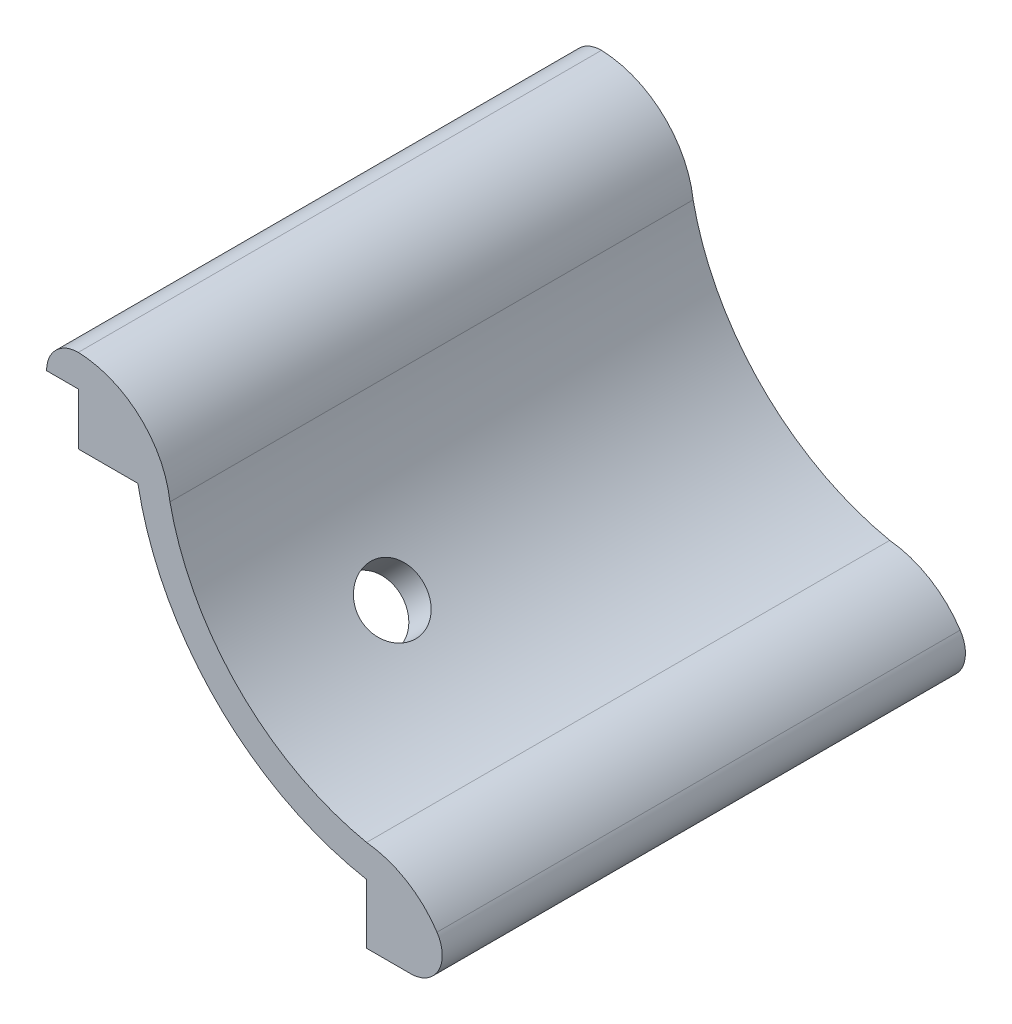
ISO-10303-21;
HEADER;
FILE_DESCRIPTION(('STEP AP214'),'2;1');
FILE_NAME('part.step','',(''),(''),'','','');
FILE_SCHEMA(('AUTOMOTIVE_DESIGN { 1 0 10303 214 1 1 1 1 }'));
ENDSEC;
DATA;
#1=APPLICATION_CONTEXT('core data for automotive mechanical design processes');
#2=APPLICATION_PROTOCOL_DEFINITION('international standard','automotive_design',2000,#1);
#3=PRODUCT_CONTEXT('',#1,'mechanical');
#4=PRODUCT('Part','Part','',(#3));
#5=PRODUCT_RELATED_PRODUCT_CATEGORY('part','',(#4));
#6=PRODUCT_DEFINITION_FORMATION('','',#4);
#7=PRODUCT_DEFINITION_CONTEXT('part definition',#1,'design');
#8=PRODUCT_DEFINITION('design','',#6,#7);
#9=PRODUCT_DEFINITION_SHAPE('','',#8);
#10=(LENGTH_UNIT() NAMED_UNIT(*) SI_UNIT(.MILLI.,.METRE.));
#11=(NAMED_UNIT(*) PLANE_ANGLE_UNIT() SI_UNIT($,.RADIAN.));
#12=(NAMED_UNIT(*) SI_UNIT($,.STERADIAN.) SOLID_ANGLE_UNIT());
#13=UNCERTAINTY_MEASURE_WITH_UNIT(LENGTH_MEASURE(1.E-05),#10,'distance_accuracy_value','');
#14=(GEOMETRIC_REPRESENTATION_CONTEXT(3) GLOBAL_UNCERTAINTY_ASSIGNED_CONTEXT((#13)) GLOBAL_UNIT_ASSIGNED_CONTEXT((#10,
#11,#12)) REPRESENTATION_CONTEXT('',''));
#15=CARTESIAN_POINT('',(0.,0.,0.));
#16=DIRECTION('',(0.,0.,1.));
#17=DIRECTION('',(1.,0.,0.));
#18=AXIS2_PLACEMENT_3D('',#15,#16,#17);
#19=CARTESIAN_POINT('',(-3.15197105507584,-11.938,-104.775));
#20=DIRECTION('',(0.,1.,0.));
#21=DIRECTION('',(0.,0.,1.));
#22=AXIS2_PLACEMENT_3D('',#19,#20,#21);
#23=PLANE('',#22);
#24=DIRECTION('',(-1.,0.,0.));
#25=VECTOR('',#24,1.);
#26=CARTESIAN_POINT('',(-3.15197105507584,-11.938,0.));
#27=LINE('',#26,#25);
#28=CARTESIAN_POINT('',(8.80657813501905,-11.938,0.));
#29=VERTEX_POINT('',#28);
#30=CARTESIAN_POINT('',(0.,-11.938,0.));
#31=VERTEX_POINT('',#30);
#32=EDGE_CURVE('E234',#29,#31,#27,.T.);
#33=ORIENTED_EDGE('',*,*,#32,.F.);
#34=DIRECTION('',(0.,0.,1.));
#35=VECTOR('',#34,1.);
#36=CARTESIAN_POINT('',(8.80657813501905,-11.938,104.775));
#37=LINE('',#36,#35);
#38=CARTESIAN_POINT('',(8.80657813501905,-11.938,92.5957));
#39=VERTEX_POINT('',#38);
#40=EDGE_CURVE('E339',#29,#39,#37,.T.);
#41=ORIENTED_EDGE('',*,*,#40,.T.);
#42=DIRECTION('',(1.,0.,0.));
#43=VECTOR('',#42,1.);
#44=CARTESIAN_POINT('',(-1.80789407603243,-11.938,92.5957));
#45=LINE('',#44,#43);
#46=CARTESIAN_POINT('',(0.,-11.938,92.5957));
#47=VERTEX_POINT('',#46);
#48=EDGE_CURVE('E376',#47,#39,#45,.T.);
#49=ORIENTED_EDGE('',*,*,#48,.F.);
#50=DIRECTION('',(0.,0.,1.));
#51=VECTOR('',#50,1.);
#52=CARTESIAN_POINT('',(0.,-11.938,92.5957));
#53=LINE('',#52,#51);
#54=EDGE_CURVE('E369',#31,#47,#53,.T.);
#55=ORIENTED_EDGE('',*,*,#54,.F.);
#56=EDGE_LOOP('',(#33,#41,#49,#55));
#57=FACE_BOUND('',#56,.T.);
#58=ADVANCED_FACE('F48',(#57),#23,.F.);
#59=CARTESIAN_POINT('',(-57.7342,44.7636331488296,-104.775));
#60=DIRECTION('',(1.,0.,0.));
#61=DIRECTION('',(0.,0.,-1.));
#62=AXIS2_PLACEMENT_3D('',#59,#60,#61);
#63=PLANE('',#62);
#64=DIRECTION('',(0.,0.,1.));
#65=VECTOR('',#64,1.);
#66=CARTESIAN_POINT('',(-57.7342,56.197173041991,0.));
#67=LINE('',#66,#65);
#68=CARTESIAN_POINT('',(-57.7342,56.197173041991,0.));
#69=VERTEX_POINT('',#68);
#70=CARTESIAN_POINT('',(-57.7342,56.197173041991,92.5957));
#71=VERTEX_POINT('',#70);
#72=EDGE_CURVE('E189',#69,#71,#67,.T.);
#73=ORIENTED_EDGE('',*,*,#72,.F.);
#74=DIRECTION('',(0.,1.,0.));
#75=VECTOR('',#74,1.);
#76=CARTESIAN_POINT('',(-57.7342,44.7636331488296,0.));
#77=LINE('',#76,#75);
#78=CARTESIAN_POINT('',(-57.7342,45.796198295609,0.));
#79=VERTEX_POINT('',#78);
#80=EDGE_CURVE('E206',#79,#69,#77,.T.);
#81=ORIENTED_EDGE('',*,*,#80,.F.);
#82=DIRECTION('',(0.,0.,-1.));
#83=VECTOR('',#82,1.);
#84=CARTESIAN_POINT('',(-57.7342,45.796198295609,92.5957));
#85=LINE('',#84,#83);
#86=CARTESIAN_POINT('',(-57.7342,45.796198295609,92.5957));
#87=VERTEX_POINT('',#86);
#88=EDGE_CURVE('E481',#87,#79,#85,.T.);
#89=ORIENTED_EDGE('',*,*,#88,.F.);
#90=DIRECTION('',(0.,-1.,0.));
#91=VECTOR('',#90,1.);
#92=CARTESIAN_POINT('',(-57.7342,43.4795574980974,92.5957));
#93=LINE('',#92,#91);
#94=EDGE_CURVE('E485',#71,#87,#93,.T.);
#95=ORIENTED_EDGE('',*,*,#94,.F.);
#96=EDGE_LOOP('',(#73,#81,#89,#95));
#97=FACE_BOUND('',#96,.T.);
#98=ADVANCED_FACE('F261',(#97),#63,.F.);
#99=CARTESIAN_POINT('',(-57.7342,56.197173041991,98.425));
#100=VERTEX_POINT('',#99);
#101=CARTESIAN_POINT('',(-57.7342,56.197173041991,104.775));
#102=VERTEX_POINT('',#101);
#103=EDGE_CURVE('E340',#100,#102,#67,.T.);
#104=ORIENTED_EDGE('',*,*,#103,.F.);
#105=DIRECTION('',(0.,-1.,0.));
#106=VECTOR('',#105,1.);
#107=CARTESIAN_POINT('',(-57.7342,43.479557498097,98.425));
#108=LINE('',#107,#106);
#109=CARTESIAN_POINT('',(-57.7342,45.796198295609,98.425));
#110=VERTEX_POINT('',#109);
#111=EDGE_CURVE('E273',#100,#110,#108,.T.);
#112=ORIENTED_EDGE('',*,*,#111,.T.);
#113=DIRECTION('',(0.,0.,1.));
#114=VECTOR('',#113,1.);
#115=CARTESIAN_POINT('',(-57.7342,45.796198365176,98.425));
#116=LINE('',#115,#114);
#117=CARTESIAN_POINT('',(-57.7342,45.7961983303925,104.775));
#118=VERTEX_POINT('',#117);
#119=EDGE_CURVE('E446',#110,#118,#116,.T.);
#120=ORIENTED_EDGE('',*,*,#119,.T.);
#121=DIRECTION('',(0.,1.,0.));
#122=VECTOR('',#121,1.);
#123=CARTESIAN_POINT('',(-57.7342,44.7636331488296,104.775));
#124=LINE('',#123,#122);
#125=EDGE_CURVE('E248',#118,#102,#124,.T.);
#126=ORIENTED_EDGE('',*,*,#125,.T.);
#127=EDGE_LOOP('',(#104,#112,#120,#126));
#128=FACE_BOUND('',#127,.T.);
#129=ADVANCED_FACE('F304',(#128),#63,.F.);
#130=CARTESIAN_POINT('',(10.3996216396257,56.1958216396257,104.775));
#131=DIRECTION('',(0.,0.,-1.));
#132=DIRECTION('',(-1.,0.,0.));
#133=AXIS2_PLACEMENT_3D('',#130,#131,#132);
#134=CYLINDRICAL_SURFACE('',#133,50.8493081391342);
#135=CARTESIAN_POINT('',(-20.784677775749,16.0312650231152,74.1653983481804));
#136=CARTESIAN_POINT('',(-20.7846758379988,16.0312640782977,73.9877425355122));
#137=CARTESIAN_POINT('',(-20.7906163656934,16.0358738632272,73.8101166359393));
#138=CARTESIAN_POINT('',(-20.8143178376221,16.0542925575826,73.456078640127));
#139=CARTESIAN_POINT('',(-20.8320814626029,16.0681035532744,73.2796668283348));
#140=CARTESIAN_POINT('',(-20.8792768997005,16.104880828446,72.9292457067245));
#141=CARTESIAN_POINT('',(-20.9087174107754,16.1278539335154,72.7552382883509));
#142=CARTESIAN_POINT('',(-20.9789911767397,16.1828639104535,72.4109289915647));
#143=CARTESIAN_POINT('',(-21.0198286055127,16.2149041030144,72.2406284954137));
#144=CARTESIAN_POINT('',(-21.1124489123162,16.2878648376146,71.90518108893));
#145=CARTESIAN_POINT('',(-21.1642202199296,16.3287759934616,71.7400289408855));
#146=CARTESIAN_POINT('',(-21.2782644666517,16.4193339838851,71.4157869498506));
#147=CARTESIAN_POINT('',(-21.3405412736183,16.4689840361942,71.2566993662228));
#148=CARTESIAN_POINT('',(-21.4749665766108,16.5767583301998,70.9458433130397));
#149=CARTESIAN_POINT('',(-21.5471096505836,16.6348779185654,70.7940708849377));
#150=CARTESIAN_POINT('',(-21.7006640586808,16.7593719366749,70.4987463716751));
#151=CARTESIAN_POINT('',(-21.7820788236987,16.8257494230139,70.3551973592307));
#152=CARTESIAN_POINT('',(-21.9538234493409,16.9667619165018,70.076727608308));
#153=CARTESIAN_POINT('',(-22.0441927786658,17.0414336741289,69.9418498192395));
#154=CARTESIAN_POINT('',(-22.2327644790782,17.1984554560064,69.6823414984428));
#155=CARTESIAN_POINT('',(-22.3309697347996,17.2808083097954,69.5577147750395));
#156=CARTESIAN_POINT('',(-22.5342991771346,17.4527356384182,69.319671966118));
#157=CARTESIAN_POINT('',(-22.6394211541478,17.5423078090223,69.2062523290974));
#158=CARTESIAN_POINT('',(-22.8557557722319,17.7282721832445,68.9913354332248));
#159=CARTESIAN_POINT('',(-22.966970645668,17.8246668903868,68.8898425876238));
#160=CARTESIAN_POINT('',(-23.1948591810651,18.0240260827484,68.6992672889067));
#161=CARTESIAN_POINT('',(-23.3115479330361,18.1270090530023,68.6102222062909));
#162=CARTESIAN_POINT('',(-23.5491526960708,18.3387457346387,68.4455091667207));
#163=CARTESIAN_POINT('',(-23.6700702597575,18.447501573302,68.3698461861408));
#164=CARTESIAN_POINT('',(-23.9150674434826,18.6700758491484,68.2325177007512));
#165=CARTESIAN_POINT('',(-24.0391457826943,18.7838922491736,68.1708466233539));
#166=CARTESIAN_POINT('',(-24.2895177842526,19.0159213967149,68.0619012297004));
#167=CARTESIAN_POINT('',(-24.4158122423365,19.1341357411945,68.0146322014569));
#168=CARTESIAN_POINT('',(-24.7951058861629,19.4929157175488,67.8954892598048));
#169=CARTESIAN_POINT('',(-25.0500831674502,19.7390384714563,67.8454048635367));
#170=CARTESIAN_POINT('',(-25.5569990712281,20.2388959611675,67.8053842778971));
#171=CARTESIAN_POINT('',(-25.8089378126496,20.4926303976787,67.8154457266599));
#172=CARTESIAN_POINT('',(-26.3014125291408,20.9990854107234,67.8951044844073));
#173=CARTESIAN_POINT('',(-26.5420041929187,21.2518037641268,67.9643699242668));
#174=CARTESIAN_POINT('',(-27.0069467553929,21.7499658444348,68.1599728299261));
#175=CARTESIAN_POINT('',(-27.2312973457521,21.9954094331757,68.28631137893));
#176=CARTESIAN_POINT('',(-27.658964332413,22.4719569378085,68.5928216535387));
#177=CARTESIAN_POINT('',(-27.8622226167808,22.7030205697384,68.7731370527942));
#178=CARTESIAN_POINT('',(-28.2425559101616,23.1425485728031,69.1823795244599));
#179=CARTESIAN_POINT('',(-28.4196297200369,23.3510119088238,69.4113088220113));
#180=CARTESIAN_POINT('',(-28.7451320769304,23.7396170575814,69.9131395159331));
#181=CARTESIAN_POINT('',(-28.8933569814812,23.9195559755991,70.1863302139981));
#182=CARTESIAN_POINT('',(-29.1568166833921,24.2429817471022,70.7679350616216));
#183=CARTESIAN_POINT('',(-29.2720513777039,24.3864684867252,71.0763493212001));
#184=CARTESIAN_POINT('',(-29.4674697357491,24.631729944493,71.7199024928084));
#185=CARTESIAN_POINT('',(-29.5476385454196,24.7334869846161,72.0550526593455));
#186=CARTESIAN_POINT('',(-29.6714125027643,24.8912770822634,72.7424310056511));
#187=CARTESIAN_POINT('',(-29.7150194090193,24.9473123389436,73.0946583631663));
#188=CARTESIAN_POINT('',(-29.7647299894072,25.0112316478475,73.8036538336623));
#189=CARTESIAN_POINT('',(-29.7710841593381,25.0194373148526,74.1603754153208));
#190=CARTESIAN_POINT('',(-29.7468481252507,24.9882347648532,74.870458333908));
#191=CARTESIAN_POINT('',(-29.7162587071177,24.9488275606969,75.2238197421549));
#192=CARTESIAN_POINT('',(-29.6188406085102,24.8241628234696,75.9159395175769));
#193=CARTESIAN_POINT('',(-29.5521342064133,24.7390600063821,76.2547430183965));
#194=CARTESIAN_POINT('',(-29.3837297256164,24.5263507615543,76.9095415163362));
#195=CARTESIAN_POINT('',(-29.2820304197638,24.398742843224,77.2255357130953));
#196=CARTESIAN_POINT('',(-29.0448171301137,24.1049492824693,77.827576069567));
#197=CARTESIAN_POINT('',(-28.909127741626,23.9385638501178,78.1134556008042));
#198=CARTESIAN_POINT('',(-28.6067183313669,23.5735346346971,78.645451328399));
#199=CARTESIAN_POINT('',(-28.4399971049578,23.3748895993673,78.8915659804144));
#200=CARTESIAN_POINT('',(-28.0777743520527,22.9509699025115,79.3384670821353));
#201=CARTESIAN_POINT('',(-27.8821145042345,22.7255501867508,79.5389877191848));
#202=CARTESIAN_POINT('',(-27.4669399656904,22.2565588791134,79.8871677792367));
#203=CARTESIAN_POINT('',(-27.2474257551098,22.012987652625,80.0348282659621));
#204=CARTESIAN_POINT('',(-26.790403868182,21.5163214152437,80.2726639805755));
#205=CARTESIAN_POINT('',(-26.5529462100359,21.2632538012913,80.3629928561885));
#206=CARTESIAN_POINT('',(-26.0654727382239,20.7547052913181,80.4840769371137));
#207=CARTESIAN_POINT('',(-25.815457490221,20.4992245044202,80.5148348233669));
#208=CARTESIAN_POINT('',(-25.4374834890998,20.1210952727644,80.5156678338306));
#209=CARTESIAN_POINT('',(-25.3113689406867,19.9962543252022,80.5084803466135));
#210=CARTESIAN_POINT('',(-25.0587343461175,19.7487602479902,80.4792836799403));
#211=CARTESIAN_POINT('',(-24.9322144684644,19.6261063208853,80.4572800212536));
#212=CARTESIAN_POINT('',(-24.6796584200521,19.3837730591713,80.3985968149713));
#213=CARTESIAN_POINT('',(-24.5536224417095,19.2640948213513,80.3619119388599));
#214=CARTESIAN_POINT('',(-24.3030745503758,19.0285704768257,80.2741567020779));
#215=CARTESIAN_POINT('',(-24.1785620999804,18.9127229927972,80.2230915759811));
#216=CARTESIAN_POINT('',(-23.9319832437464,18.6855410015803,80.1069423152315));
#217=CARTESIAN_POINT('',(-23.8099168554385,18.5742065267307,80.0418580801437));
#218=CARTESIAN_POINT('',(-23.569238859773,18.3567551794769,79.8981675337228));
#219=CARTESIAN_POINT('',(-23.450626016148,18.2506364303988,79.8195661324916));
#220=CARTESIAN_POINT('',(-23.2177190427181,18.0441404428537,79.6493542285085));
#221=CARTESIAN_POINT('',(-23.1034265118438,17.9437653231551,79.557738967921));
#222=CARTESIAN_POINT('',(-22.8801801351203,17.7493805220018,79.3622025847223));
#223=CARTESIAN_POINT('',(-22.7712243880698,17.6553685690774,79.2582858901776));
#224=CARTESIAN_POINT('',(-22.5587800928004,17.473533724783,79.0380860507307));
#225=CARTESIAN_POINT('',(-22.4553344939409,17.3857580549841,78.9217224647295));
#226=CARTESIAN_POINT('',(-22.2556504353514,17.2175920627673,78.6780864303809));
#227=CARTESIAN_POINT('',(-22.1594093763419,17.1371990744028,78.5508179522261));
#228=CARTESIAN_POINT('',(-21.9748756421674,16.9841084719742,78.2861419590941));
#229=CARTESIAN_POINT('',(-21.88658780925,16.9114155413452,78.1487283587513));
#230=CARTESIAN_POINT('',(-21.7188429314244,16.7741509883806,77.8648393850357));
#231=CARTESIAN_POINT('',(-21.6393826375847,16.7095763769784,77.7183673766683));
#232=CARTESIAN_POINT('',(-21.4896594029315,16.5885596517188,77.4166967518702));
#233=CARTESIAN_POINT('',(-21.4194368537181,16.5321531509295,77.2614637933775));
#234=CARTESIAN_POINT('',(-21.2892667019064,16.4280779431244,76.9439954529031));
#235=CARTESIAN_POINT('',(-21.229315329925,16.380406030185,76.7817626672432));
#236=CARTESIAN_POINT('',(-21.120268820754,16.2940236303479,76.4515155852004));
#237=CARTESIAN_POINT('',(-21.0711652037926,16.2553061425903,76.2835059242302));
#238=CARTESIAN_POINT('',(-20.9842411764885,16.1869683517968,75.942842846369));
#239=CARTESIAN_POINT('',(-20.9464181024135,16.1573459010545,75.7701905362847));
#240=CARTESIAN_POINT('',(-20.8714356163363,16.09873761373,75.3615909849788));
#241=CARTESIAN_POINT('',(-20.8389466963619,16.0734496816345,75.1242314732524));
#242=CARTESIAN_POINT('',(-20.7955691691487,16.0397140894383,74.646362475001));
#243=CARTESIAN_POINT('',(-20.7846803984667,16.0312663019124,74.4058530123248));
#244=CARTESIAN_POINT('',(-20.784677775749,16.0312650231152,74.1653983481804));
#245=B_SPLINE_CURVE_WITH_KNOTS('',3,(#135,#136,#137,#138,#139,#140,#141,#142,#143,#144,#145,
#146,#147,#148,#149,#150,#151,#152,#153,#154,#155,#156,#157,#158,#159,#160,#161,#162,#163,#164,
#165,#166,#167,#168,#169,#170,#171,#172,#173,#174,#175,#176,#177,#178,#179,#180,#181,#182,#183,
#184,#185,#186,#187,#188,#189,#190,#191,#192,#193,#194,#195,#196,#197,#198,#199,#200,#201,#202,
#203,#204,#205,#206,#207,#208,#209,#210,#211,#212,#213,#214,#215,#216,#217,#218,#219,#220,#221,
#222,#223,#224,#225,#226,#227,#228,#229,#230,#231,#232,#233,#234,#235,#236,#237,#238,#239,#240,
#241,#242,#243,#244),.UNSPECIFIED.,.T.,.F.,(4,2,2,2,2,2,2,2,2,2,2,2,2,2,2,2,2,2,2,2,2,2,2,2,2,2,
2,2,2,2,2,2,2,2,2,2,2,2,2,2,2,2,2,2,2,2,2,2,2,2,2,2,2,2,4),(0.,0.532756982485454,
1.06563480245308,1.59891034959374,2.13238145465854,2.66529083505228,3.19839684907792,
3.73121106074064,4.26422307939406,4.79969883521099,5.33537263294963,5.87087612866381,
6.4065771560474,6.94385341969071,7.48132906097656,8.01859026335157,8.55604849531332,
9.62418538266552,10.6922803256521,11.7544270143045,12.8165938625388,13.881613475514,
14.9466818467676,16.0190155495312,17.0913526018024,18.1641434618826,19.2368827191308,
20.3024002870778,21.3678951891245,22.4298050841358,23.4917522226538,24.5592966600851,
25.6268825476099,26.7005413784938,27.7741786025577,28.8449262110285,29.9156256303049,
30.4479079008159,30.979991943148,31.5122692796178,32.0443531110049,32.5764407544491,
33.1083355240895,33.6404252560677,34.1723240342959,34.7078958366272,35.2432734727896,
35.7789748961692,36.3144784995272,36.8522508108873,37.3898253423647,37.9269781490175,
38.464004014421,39.1850886145392,39.906167758363),.UNSPECIFIED.);
#246=CARTESIAN_POINT('',(-20.784677775749,16.0312650231152,74.1653983481804));
#247=VERTEX_POINT('',#246);
#248=EDGE_CURVE('E238',#247,#247,#245,.T.);
#249=ORIENTED_EDGE('',*,*,#248,.F.);
#250=EDGE_LOOP('',(#249));
#251=FACE_BOUND('',#250,.T.);
#252=DIRECTION('',(0.,0.,-1.));
#253=VECTOR('',#252,1.);
#254=CARTESIAN_POINT('',(0.,6.42133010047239,104.775));
#255=LINE('',#254,#253);
#256=CARTESIAN_POINT('',(0.,6.42133010047239,104.775));
#257=VERTEX_POINT('',#256);
#258=CARTESIAN_POINT('',(0.,6.42133010047239,0.));
#259=VERTEX_POINT('',#258);
#260=EDGE_CURVE('E422',#257,#259,#255,.T.);
#261=ORIENTED_EDGE('',*,*,#260,.T.);
#262=CARTESIAN_POINT('',(10.3996216396257,56.1958216396257,0.));
#263=DIRECTION('',(0.,0.,-1.));
#264=DIRECTION('',(-1.,0.,0.));
#265=AXIS2_PLACEMENT_3D('',#262,#263,#264);
#266=CIRCLE('',#265,50.8493081391342);
#267=CARTESIAN_POINT('',(-39.3748698995276,45.7962,0.));
#268=VERTEX_POINT('',#267);
#269=EDGE_CURVE('E224',#259,#268,#266,.T.);
#270=ORIENTED_EDGE('',*,*,#269,.T.);
#271=DIRECTION('',(0.,0.,-1.));
#272=VECTOR('',#271,1.);
#273=CARTESIAN_POINT('',(-39.3748698995276,45.7962,104.775));
#274=LINE('',#273,#272);
#275=CARTESIAN_POINT('',(-39.3748698995276,45.7962,104.775));
#276=VERTEX_POINT('',#275);
#277=EDGE_CURVE('E329',#276,#268,#274,.T.);
#278=ORIENTED_EDGE('',*,*,#277,.F.);
#279=CARTESIAN_POINT('',(10.3996216396257,56.1958216396257,104.775));
#280=DIRECTION('',(0.,0.,1.));
#281=DIRECTION('',(1.,0.,0.));
#282=AXIS2_PLACEMENT_3D('',#279,#280,#281);
#283=CIRCLE('',#282,50.8493081391342);
#284=EDGE_CURVE('E408',#276,#257,#283,.T.);
#285=ORIENTED_EDGE('',*,*,#284,.T.);
#286=EDGE_LOOP('',(#261,#270,#278,#285));
#287=FACE_BOUND('',#286,.T.);
#288=ADVANCED_FACE('F250',(#251,#287),#134,.F.);
#289=CARTESIAN_POINT('',(-58.3144927056739,43.4795574980971,104.775));
#290=DIRECTION('',(0.,0.,-1.));
#291=DIRECTION('',(-1.,0.,0.));
#292=AXIS2_PLACEMENT_3D('',#289,#290,#291);
#293=CYLINDRICAL_SURFACE('',#292,19.0807794526513);
#294=ORIENTED_EDGE('',*,*,#277,.T.);
#295=CARTESIAN_POINT('',(-58.3144927056739,43.4795574980971,0.));
#296=DIRECTION('',(0.,0.,-1.));
#297=DIRECTION('',(-1.,0.,0.));
#298=AXIS2_PLACEMENT_3D('',#295,#296,#297);
#299=CIRCLE('',#298,19.0807794526513);
#300=CARTESIAN_POINT('',(-57.7342,62.5515108562736,0.));
#301=VERTEX_POINT('',#300);
#302=EDGE_CURVE('E220',#268,#301,#299,.F.);
#303=ORIENTED_EDGE('',*,*,#302,.T.);
#304=DIRECTION('',(0.,0.,-1.));
#305=VECTOR('',#304,1.);
#306=CARTESIAN_POINT('',(-57.7342,62.5515108562736,104.775));
#307=LINE('',#306,#305);
#308=CARTESIAN_POINT('',(-57.7342,62.5515108562736,104.775));
#309=VERTEX_POINT('',#308);
#310=EDGE_CURVE('E474',#309,#301,#307,.T.);
#311=ORIENTED_EDGE('',*,*,#310,.F.);
#312=CARTESIAN_POINT('',(-58.3144927056739,43.4795574980971,104.775));
#313=DIRECTION('',(0.,0.,-1.));
#314=DIRECTION('',(-1.,0.,0.));
#315=AXIS2_PLACEMENT_3D('',#312,#313,#314);
#316=CIRCLE('',#315,19.0807794526513);
#317=EDGE_CURVE('E419',#309,#276,#316,.T.);
#318=ORIENTED_EDGE('',*,*,#317,.T.);
#319=EDGE_LOOP('',(#294,#303,#311,#318));
#320=FACE_BOUND('',#319,.T.);
#321=ADVANCED_FACE('F282',(#320),#293,.T.);
#322=CARTESIAN_POINT('',(10.3996216396257,56.1958216396257,104.775));
#323=DIRECTION('',(0.,0.,-1.));
#324=DIRECTION('',(-1.,0.,0.));
#325=AXIS2_PLACEMENT_3D('',#322,#323,#324);
#326=CYLINDRICAL_SURFACE('',#325,57.15);
#327=CARTESIAN_POINT('',(-25.2711759099394,11.5447667564773,74.1653983481804));
#328=CARTESIAN_POINT('',(-25.2711741829019,11.5447658408798,74.3432105862979));
#329=CARTESIAN_POINT('',(-25.27705062888,11.5494581724657,74.5209947745028));
#330=CARTESIAN_POINT('',(-25.3004988805214,11.568205408256,74.8753504923794));
#331=CARTESIAN_POINT('',(-25.3180734273973,11.5822625069045,75.0519217280201));
#332=CARTESIAN_POINT('',(-25.3647734217154,11.6196908363811,75.4026681553874));
#333=CARTESIAN_POINT('',(-25.3939078293559,11.6430692923832,75.5768413797696));
#334=CARTESIAN_POINT('',(-25.4634638080088,11.6990398011421,75.9214814564594));
#335=CARTESIAN_POINT('',(-25.5038895118512,11.7316352275401,76.0919469269871));
#336=CARTESIAN_POINT('',(-25.5955986151754,11.8058442653233,76.4277276116231));
#337=CARTESIAN_POINT('',(-25.64687101168,11.8474487388556,76.5930478516068));
#338=CARTESIAN_POINT('',(-25.7598458828205,11.9395145545843,76.9176169970162));
#339=CARTESIAN_POINT('',(-25.8215521982982,11.9899791585563,77.0768636401312));
#340=CARTESIAN_POINT('',(-25.9547837359532,12.0994823704733,77.3880201543668));
#341=CARTESIAN_POINT('',(-26.0263034226456,12.1585161458358,77.5399340968417));
#342=CARTESIAN_POINT('',(-26.1785783169549,12.2849166329591,77.8355195018542));
#343=CARTESIAN_POINT('',(-26.2593369393043,12.3522864264874,77.9791878871614));
#344=CARTESIAN_POINT('',(-26.4296666368615,12.4952675363267,78.2577254874705));
#345=CARTESIAN_POINT('',(-26.5192684073997,12.5709076651512,78.3925611430486));
#346=CARTESIAN_POINT('',(-26.7062962091356,12.7298760707904,78.6519706280747));
#347=CARTESIAN_POINT('',(-26.8037251209153,12.8132071797711,78.7765406450304));
#348=CARTESIAN_POINT('',(-27.0055144017417,12.9870722454288,79.0144521383945));
#349=CARTESIAN_POINT('',(-27.1098725389592,13.0776038847333,79.1277972012153));
#350=CARTESIAN_POINT('',(-27.3247118640434,13.26544165883,79.3425458695376));
#351=CARTESIAN_POINT('',(-27.4351952967198,13.3627502806555,79.4439450539767));
#352=CARTESIAN_POINT('',(-27.661591129471,13.5637967602304,79.6342469687407));
#353=CARTESIAN_POINT('',(-27.7775151264601,13.6675485195382,79.7231212234536));
#354=CARTESIAN_POINT('',(-28.0136550442086,13.8807180731477,79.887494577209));
#355=CARTESIAN_POINT('',(-28.1338725400139,13.9901379535378,79.9629887059967));
#356=CARTESIAN_POINT('',(-28.3775545791478,14.2139157260285,80.0999863018322));
#357=CARTESIAN_POINT('',(-28.5010178274823,14.3282716600842,80.1614952569545));
#358=CARTESIAN_POINT('',(-28.7502610376259,14.5612399513603,80.2701274499364));
#359=CARTESIAN_POINT('',(-28.8760418336105,14.6798538563554,80.3172453962529));
#360=CARTESIAN_POINT('',(-29.2542493469181,15.0398604735931,80.4360464244693));
#361=CARTESIAN_POINT('',(-29.5088330869046,15.2866013690773,80.4858997580058));
#362=CARTESIAN_POINT('',(-30.0155087947085,15.7870754643081,80.5254176431404));
#363=CARTESIAN_POINT('',(-30.2676008408496,16.0408084433096,80.5150840927187));
#364=CARTESIAN_POINT('',(-30.7612199184768,16.546963134078,80.4347981837689));
#365=CARTESIAN_POINT('',(-31.0027886434247,16.7993856934137,80.3651089770687));
#366=CARTESIAN_POINT('',(-31.4701225692031,17.2964193420388,80.1684794558188));
#367=CARTESIAN_POINT('',(-31.6958875240847,17.5410303097269,80.0415382505044));
#368=CARTESIAN_POINT('',(-32.1265565134039,18.0153343756781,79.7337287778815));
#369=CARTESIAN_POINT('',(-32.3314146335912,18.2449942554173,79.5527451060737));
#370=CARTESIAN_POINT('',(-32.7150574833546,18.6814043864699,79.1420705085569));
#371=CARTESIAN_POINT('',(-32.8938412675556,18.8881538070557,78.9123778175498));
#372=CARTESIAN_POINT('',(-33.2224342179301,19.2728852629503,78.4093278493588));
#373=CARTESIAN_POINT('',(-33.3720816534142,19.4507058709816,78.1357414087352));
#374=CARTESIAN_POINT('',(-33.6381635496716,19.7700160488709,77.5534614140858));
#375=CARTESIAN_POINT('',(-33.7545979417554,19.9115055435908,77.2447677874551));
#376=CARTESIAN_POINT('',(-33.9520143454244,20.1530782729087,76.6008488557037));
#377=CARTESIAN_POINT('',(-34.0329860113325,20.2531494239073,76.2656158417797));
#378=CARTESIAN_POINT('',(-34.1578719661044,20.4080827416861,75.5782288487483));
#379=CARTESIAN_POINT('',(-34.2017876558686,20.4629466175247,75.2260755098456));
#380=CARTESIAN_POINT('',(-34.251596447066,20.5252058149237,74.516855312734));
#381=CARTESIAN_POINT('',(-34.2576911200291,20.5328527834182,74.159824684513));
#382=CARTESIAN_POINT('',(-34.2322808776481,20.501057659942,73.4492204976223));
#383=CARTESIAN_POINT('',(-34.2007765920987,20.4616163567149,73.0956468811465));
#384=CARTESIAN_POINT('',(-34.1008955440057,20.3373117024242,72.4029384317117));
#385=CARTESIAN_POINT('',(-34.0326157605222,20.2525678211764,72.0637681428955));
#386=CARTESIAN_POINT('',(-33.8605297559075,20.0408773538875,71.4083890967544));
#387=CARTESIAN_POINT('',(-33.7567225375999,19.9139295832797,71.0921809842289));
#388=CARTESIAN_POINT('',(-33.5150504592128,19.6217867469268,70.4902460094976));
#389=CARTESIAN_POINT('',(-33.377044663003,19.4564335897918,70.2046524720766));
#390=CARTESIAN_POINT('',(-33.0699249446063,19.0935660391673,69.673409211465));
#391=CARTESIAN_POINT('',(-32.9008100698746,18.8960506609076,69.4277607118057));
#392=CARTESIAN_POINT('',(-32.5341694940112,18.4746034822548,68.9822663483468));
#393=CARTESIAN_POINT('',(-32.3365201453651,18.2505575193253,68.7826301844754));
#394=CARTESIAN_POINT('',(-31.9178095175074,17.784162499317,68.4362755399743));
#395=CARTESIAN_POINT('',(-31.6967486235785,17.5418137434652,68.2895561886701));
#396=CARTESIAN_POINT('',(-31.2371272429008,17.0471640377356,68.0535449171342));
#397=CARTESIAN_POINT('',(-30.998605910599,16.7948859084082,67.9641286415056));
#398=CARTESIAN_POINT('',(-30.5096915890919,16.2874973127987,67.8448810793665));
#399=CARTESIAN_POINT('',(-30.2592990177707,16.0323869464571,67.8150476970465));
#400=CARTESIAN_POINT('',(-29.8811060840014,15.6542701225956,67.8155781784565));
#401=CARTESIAN_POINT('',(-29.7548845066093,15.5292557335102,67.8232364283295));
#402=CARTESIAN_POINT('',(-29.5022045835301,15.2813012104743,67.8534081259847));
#403=CARTESIAN_POINT('',(-29.3757463432713,15.1583603228999,67.8759160518168));
#404=CARTESIAN_POINT('',(-29.1234780425297,14.9153442916327,67.9356392608223));
#405=CARTESIAN_POINT('',(-28.9976682355896,14.7952702107526,67.9728599113565));
#406=CARTESIAN_POINT('',(-28.7477300038509,14.5588557121284,68.0617160518105));
#407=CARTESIAN_POINT('',(-28.6236009827524,14.4425139490703,68.1133462812027));
#408=CARTESIAN_POINT('',(-28.3779193381473,14.2142430327983,68.2306615049935));
#409=CARTESIAN_POINT('',(-28.2563670883843,14.1023145176994,68.2963485231132));
#410=CARTESIAN_POINT('',(-28.0168534409773,13.8836102202584,68.4412732245603));
#411=CARTESIAN_POINT('',(-27.8988907530942,13.7768325782029,68.5205059695609));
#412=CARTESIAN_POINT('',(-27.6674076092863,13.568975706954,68.6920051210898));
#413=CARTESIAN_POINT('',(-27.553888764984,13.4678985393679,68.7842762012443));
#414=CARTESIAN_POINT('',(-27.3322967893092,13.2720905685644,68.9811430511909));
#415=CARTESIAN_POINT('',(-27.2242217067818,13.1773574874277,69.085734359638));
#416=CARTESIAN_POINT('',(-27.0137774761673,12.9942055070609,69.3071502168258));
#417=CARTESIAN_POINT('',(-26.9114433332173,12.9058245783218,69.4240394515529));
#418=CARTESIAN_POINT('',(-26.7140336482692,12.7364612732726,69.6687006667185));
#419=CARTESIAN_POINT('',(-26.618955478216,12.6554762161268,69.7964686711389));
#420=CARTESIAN_POINT('',(-26.4367760395996,12.5012388649295,70.0621113118644));
#421=CARTESIAN_POINT('',(-26.349679647456,12.4279912939319,70.199992035092));
#422=CARTESIAN_POINT('',(-26.1843203215952,12.2896795950715,70.4847744039092));
#423=CARTESIAN_POINT('',(-26.1060541379669,12.2246124554298,70.6316726996906));
#424=CARTESIAN_POINT('',(-25.9587588382393,12.1027400690436,70.9340317665308));
#425=CARTESIAN_POINT('',(-25.8897626104808,12.0459641794912,71.0895203982904));
#426=CARTESIAN_POINT('',(-25.7619795399754,11.9412408046953,71.4074345469462));
#427=CARTESIAN_POINT('',(-25.7031889556714,11.8932900836097,71.5698574942824));
#428=CARTESIAN_POINT('',(-25.5963728586298,11.8064578270388,71.9004127013252));
#429=CARTESIAN_POINT('',(-25.5483386979986,11.7675690049867,72.0685402485282));
#430=CARTESIAN_POINT('',(-25.4634372786737,11.6990074290188,72.4093706362201));
#431=CARTESIAN_POINT('',(-25.4265673213836,11.6693324479016,72.5820723600515));
#432=CARTESIAN_POINT('',(-25.3542632755163,11.6112384811239,72.9873084693907));
#433=CARTESIAN_POINT('',(-25.3231461506669,11.5863264590002,73.2211375363889));
#434=CARTESIAN_POINT('',(-25.2816036747642,11.5530912519952,73.6917937753546));
#435=CARTESIAN_POINT('',(-25.2711782096883,11.5447679757005,73.9286209307936));
#436=CARTESIAN_POINT('',(-25.2711759099394,11.5447667564773,74.1653983481804));
#437=B_SPLINE_CURVE_WITH_KNOTS('',3,(#327,#328,#329,#330,#331,#332,#333,#334,#335,#336,#337,
#338,#339,#340,#341,#342,#343,#344,#345,#346,#347,#348,#349,#350,#351,#352,#353,#354,#355,#356,
#357,#358,#359,#360,#361,#362,#363,#364,#365,#366,#367,#368,#369,#370,#371,#372,#373,#374,#375,
#376,#377,#378,#379,#380,#381,#382,#383,#384,#385,#386,#387,#388,#389,#390,#391,#392,#393,#394,
#395,#396,#397,#398,#399,#400,#401,#402,#403,#404,#405,#406,#407,#408,#409,#410,#411,#412,#413,
#414,#415,#416,#417,#418,#419,#420,#421,#422,#423,#424,#425,#426,#427,#428,#429,#430,#431,#432,
#433,#434,#435,#436),.UNSPECIFIED.,.T.,.F.,(4,2,2,2,2,2,2,2,2,2,2,2,2,2,2,2,2,2,2,2,2,2,2,2,2,2,
2,2,2,2,2,2,2,2,2,2,2,2,2,2,2,2,2,2,2,2,2,2,2,2,2,2,2,2,4),(0.,0.533229575118429,
1.0665841457857,1.60035293665173,2.13431735367829,2.66774268792771,3.20136481116851,
3.73468715913484,4.26820726505183,4.80364915382741,5.33928900922338,5.87475716989428,
6.4104228840885,6.94728744608273,7.48435101863855,8.02120347105991,8.55825308598672,
9.62673898738077,10.6951911944862,11.7589309562493,12.8226872689554,13.888731616285,
14.9548146054898,16.0266563199259,17.0985002510733,18.1706566674084,19.242772549073,
20.3091695215793,21.3755486318452,22.4391293110637,23.5027398450823,24.570808735953,
25.6389103360086,26.7117875489153,27.7846471082766,28.8551704623629,29.9256561604656,
30.4585906671507,30.9913271102367,31.5242580809636,32.0569947476622,32.5898081627988,
33.1224277442901,33.6552387312994,34.1878573689337,34.723432673855,35.2588130678847,
35.7945183987023,36.3300259183819,36.8673858075487,37.4045482737387,37.9412773118341,
38.4778765087433,39.1879368440664,39.8979932665463),.UNSPECIFIED.);
#438=CARTESIAN_POINT('',(-25.2711759099394,11.5447667564773,74.1653983481804));
#439=VERTEX_POINT('',#438);
#440=EDGE_CURVE('E237',#439,#439,#437,.T.);
#441=ORIENTED_EDGE('',*,*,#440,.F.);
#442=EDGE_LOOP('',(#441));
#443=FACE_BOUND('',#442,.T.);
#444=DIRECTION('',(0.,0.,-1.));
#445=VECTOR('',#444,1.);
#446=CARTESIAN_POINT('',(-45.7961996845846,45.796198295609,92.5957));
#447=LINE('',#446,#445);
#448=CARTESIAN_POINT('',(-45.7961996845846,45.796198295609,92.5957));
#449=VERTEX_POINT('',#448);
#450=CARTESIAN_POINT('',(-45.7961996845846,45.796198295609,0.));
#451=VERTEX_POINT('',#450);
#452=EDGE_CURVE('E404',#449,#451,#447,.T.);
#453=ORIENTED_EDGE('',*,*,#452,.T.);
#454=CARTESIAN_POINT('',(10.3996216396257,56.1958216396257,0.));
#455=DIRECTION('',(0.,0.,-1.));
#456=DIRECTION('',(-1.,0.,0.));
#457=AXIS2_PLACEMENT_3D('',#454,#455,#456);
#458=CIRCLE('',#457,57.15);
#459=CARTESIAN_POINT('',(0.,0.,0.));
#460=VERTEX_POINT('',#459);
#461=EDGE_CURVE('E212',#451,#460,#458,.F.);
#462=ORIENTED_EDGE('',*,*,#461,.T.);
#463=DIRECTION('',(0.,0.,-1.));
#464=VECTOR('',#463,1.);
#465=CARTESIAN_POINT('',(0.,0.,92.5957));
#466=LINE('',#465,#464);
#467=CARTESIAN_POINT('',(0.,0.,92.5957));
#468=VERTEX_POINT('',#467);
#469=EDGE_CURVE('E387',#468,#460,#466,.T.);
#470=ORIENTED_EDGE('',*,*,#469,.F.);
#471=DIRECTION('',(0.,0.,-1.));
#472=VECTOR('',#471,1.);
#473=CARTESIAN_POINT('',(0.,0.,104.775));
#474=LINE('',#473,#472);
#475=CARTESIAN_POINT('',(0.,0.,98.425));
#476=VERTEX_POINT('',#475);
#477=EDGE_CURVE('E379',#476,#468,#474,.T.);
#478=ORIENTED_EDGE('',*,*,#477,.F.);
#479=CARTESIAN_POINT('',(0.,0.,104.775));
#480=VERTEX_POINT('',#479);
#481=EDGE_CURVE('E431',#480,#476,#474,.T.);
#482=ORIENTED_EDGE('',*,*,#481,.F.);
#483=CARTESIAN_POINT('',(10.3996216396257,56.1958216396257,104.775));
#484=DIRECTION('',(0.,0.,-1.));
#485=DIRECTION('',(-1.,0.,0.));
#486=AXIS2_PLACEMENT_3D('',#483,#484,#485);
#487=CIRCLE('',#486,57.15);
#488=CARTESIAN_POINT('',(-45.7962,45.7962,104.775));
#489=VERTEX_POINT('',#488);
#490=EDGE_CURVE('E415',#480,#489,#487,.T.);
#491=ORIENTED_EDGE('',*,*,#490,.T.);
#492=DIRECTION('',(0.,0.,-1.));
#493=VECTOR('',#492,1.);
#494=CARTESIAN_POINT('',(-45.7962,45.7962,104.775));
#495=LINE('',#494,#493);
#496=CARTESIAN_POINT('',(-45.7962,45.7962,98.425));
#497=VERTEX_POINT('',#496);
#498=EDGE_CURVE('E426',#489,#497,#495,.T.);
#499=ORIENTED_EDGE('',*,*,#498,.T.);
#500=EDGE_CURVE('E430',#497,#449,#495,.T.);
#501=ORIENTED_EDGE('',*,*,#500,.T.);
#502=EDGE_LOOP('',(#453,#462,#470,#478,#482,#491,#499,#501));
#503=FACE_BOUND('',#502,.T.);
#504=ADVANCED_FACE('F276',(#443,#503),#326,.T.);
#505=CARTESIAN_POINT('',(-1.87934056653368,-12.6385492205695,104.775));
#506=DIRECTION('',(0.,0.,-1.));
#507=DIRECTION('',(-1.,0.,0.));
#508=AXIS2_PLACEMENT_3D('',#505,#506,#507);
#509=CYLINDRICAL_SURFACE('',#508,19.1523084952624);
#510=CARTESIAN_POINT('',(-1.87934056653368,-12.6385492205695,104.775));
#511=DIRECTION('',(0.,0.,-1.));
#512=DIRECTION('',(-1.,0.,0.));
#513=AXIS2_PLACEMENT_3D('',#510,#511,#512);
#514=CIRCLE('',#513,19.1523084952624);
#515=CARTESIAN_POINT('',(14.106839707373,-2.09089730424912,104.775));
#516=VERTEX_POINT('',#515);
#517=EDGE_CURVE('E412',#257,#516,#514,.T.);
#518=ORIENTED_EDGE('',*,*,#517,.T.);
#519=DIRECTION('',(0.,0.,-1.));
#520=VECTOR('',#519,1.);
#521=CARTESIAN_POINT('',(14.106839707373,-2.09089730424912,104.775));
#522=LINE('',#521,#520);
#523=CARTESIAN_POINT('',(14.106839707373,-2.09089730424912,0.));
#524=VERTEX_POINT('',#523);
#525=EDGE_CURVE('E71',#516,#524,#522,.T.);
#526=ORIENTED_EDGE('',*,*,#525,.T.);
#527=CARTESIAN_POINT('',(-1.87934056653368,-12.6385492205695,0.));
#528=DIRECTION('',(0.,0.,-1.));
#529=DIRECTION('',(-1.,0.,0.));
#530=AXIS2_PLACEMENT_3D('',#527,#528,#529);
#531=CIRCLE('',#530,19.1523084952624);
#532=EDGE_CURVE('E231',#524,#259,#531,.F.);
#533=ORIENTED_EDGE('',*,*,#532,.T.);
#534=ORIENTED_EDGE('',*,*,#260,.F.);
#535=EDGE_LOOP('',(#518,#526,#533,#534));
#536=FACE_BOUND('',#535,.T.);
#537=ADVANCED_FACE('F281',(#536),#509,.T.);
#538=CARTESIAN_POINT('',(-58.2422,45.796198295609,92.5957));
#539=DIRECTION('',(0.,1.,0.));
#540=DIRECTION('',(-1.,0.,0.));
#541=AXIS2_PLACEMENT_3D('',#538,#539,#540);
#542=PLANE('',#541);
#543=DIRECTION('',(-1.,0.,0.));
#544=VECTOR('',#543,1.);
#545=CARTESIAN_POINT('',(-58.2422,45.796198295609,0.));
#546=LINE('',#545,#544);
#547=EDGE_CURVE('E208',#451,#79,#546,.T.);
#548=ORIENTED_EDGE('',*,*,#547,.F.);
#549=ORIENTED_EDGE('',*,*,#452,.F.);
#550=DIRECTION('',(1.,0.,0.));
#551=VECTOR('',#550,1.);
#552=CARTESIAN_POINT('',(-58.2422,45.796198295609,92.5957));
#553=LINE('',#552,#551);
#554=EDGE_CURVE('E401',#87,#449,#553,.T.);
#555=ORIENTED_EDGE('',*,*,#554,.F.);
#556=ORIENTED_EDGE('',*,*,#88,.T.);
#557=EDGE_LOOP('',(#548,#549,#555,#556));
#558=FACE_BOUND('',#557,.T.);
#559=ADVANCED_FACE('F291',(#558),#542,.F.);
#560=CARTESIAN_POINT('',(0.,0.,92.5957));
#561=DIRECTION('',(1.,0.,0.));
#562=DIRECTION('',(0.,1.,0.));
#563=AXIS2_PLACEMENT_3D('',#560,#561,#562);
#564=PLANE('',#563);
#565=DIRECTION('',(0.,1.,0.));
#566=VECTOR('',#565,1.);
#567=CARTESIAN_POINT('',(0.,0.,0.));
#568=LINE('',#567,#566);
#569=EDGE_CURVE('E228',#31,#460,#568,.T.);
#570=ORIENTED_EDGE('',*,*,#569,.F.);
#571=ORIENTED_EDGE('',*,*,#54,.T.);
#572=DIRECTION('',(0.,-1.,0.));
#573=VECTOR('',#572,1.);
#574=CARTESIAN_POINT('',(0.,0.,92.5957));
#575=LINE('',#574,#573);
#576=EDGE_CURVE('E382',#468,#47,#575,.T.);
#577=ORIENTED_EDGE('',*,*,#576,.F.);
#578=ORIENTED_EDGE('',*,*,#469,.T.);
#579=EDGE_LOOP('',(#570,#571,#577,#578));
#580=FACE_BOUND('',#579,.T.);
#581=ADVANCED_FACE('F295',(#580),#564,.F.);
#582=DIRECTION('',(1.,0.,0.));
#583=VECTOR('',#582,1.);
#584=CARTESIAN_POINT('',(-1.80789407603247,-11.938,98.425));
#585=LINE('',#584,#583);
#586=CARTESIAN_POINT('',(0.,-11.938,98.425));
#587=VERTEX_POINT('',#586);
#588=CARTESIAN_POINT('',(8.80657813501905,-11.938,98.425));
#589=VERTEX_POINT('',#588);
#590=EDGE_CURVE('E319',#587,#589,#585,.T.);
#591=ORIENTED_EDGE('',*,*,#590,.T.);
#592=DIRECTION('',(0.,0.,1.));
#593=VECTOR('',#592,1.);
#594=CARTESIAN_POINT('',(8.80657813501905,-11.938,104.775));
#595=LINE('',#594,#593);
#596=CARTESIAN_POINT('',(8.80657813501905,-11.938,104.775));
#597=VERTEX_POINT('',#596);
#598=EDGE_CURVE('E321',#589,#597,#595,.T.);
#599=ORIENTED_EDGE('',*,*,#598,.T.);
#600=DIRECTION('',(-1.,0.,0.));
#601=VECTOR('',#600,1.);
#602=CARTESIAN_POINT('',(-3.15197105507584,-11.938,104.775));
#603=LINE('',#602,#601);
#604=CARTESIAN_POINT('',(0.,-11.938,104.775));
#605=VERTEX_POINT('',#604);
#606=EDGE_CURVE('E247',#597,#605,#603,.T.);
#607=ORIENTED_EDGE('',*,*,#606,.T.);
#608=DIRECTION('',(0.,0.,-1.));
#609=VECTOR('',#608,1.);
#610=CARTESIAN_POINT('',(0.,-11.938,98.425));
#611=LINE('',#610,#609);
#612=EDGE_CURVE('E324',#605,#587,#611,.T.);
#613=ORIENTED_EDGE('',*,*,#612,.T.);
#614=EDGE_LOOP('',(#591,#599,#607,#613));
#615=FACE_BOUND('',#614,.T.);
#616=ADVANCED_FACE('F288',(#615),#23,.F.);
#617=CARTESIAN_POINT('',(-1.80789407603234,-12.601825413661,104.775));
#618=DIRECTION('',(0.,0.,-1.));
#619=DIRECTION('',(-1.,0.,0.));
#620=AXIS2_PLACEMENT_3D('',#617,#618,#619);
#621=CYLINDRICAL_SURFACE('',#620,12.7308477622877);
#622=CARTESIAN_POINT('',(-1.80789407603243,-12.6018254136611,92.5957));
#623=DIRECTION('',(0.,0.,1.));
#624=DIRECTION('',(-1.,0.,0.));
#625=AXIS2_PLACEMENT_3D('',#622,#623,#624);
#626=CIRCLE('',#625,12.7308477622878);
#627=CARTESIAN_POINT('',(10.8826052233487,-11.589050868683,92.5957));
#628=VERTEX_POINT('',#627);
#629=EDGE_CURVE('E374',#628,#468,#626,.T.);
#630=ORIENTED_EDGE('',*,*,#629,.F.);
#631=DIRECTION('',(0.,0.,-1.));
#632=VECTOR('',#631,1.);
#633=CARTESIAN_POINT('',(10.8826052233487,-11.589050868683,92.5957));
#634=LINE('',#633,#632);
#635=CARTESIAN_POINT('',(10.8826052233487,-11.589050868683,98.425));
#636=VERTEX_POINT('',#635);
#637=EDGE_CURVE('E349',#628,#636,#634,.F.);
#638=ORIENTED_EDGE('',*,*,#637,.T.);
#639=CARTESIAN_POINT('',(-1.80789407603247,-12.6018254136611,98.425));
#640=DIRECTION('',(0.,0.,1.));
#641=DIRECTION('',(-1.,0.,0.));
#642=AXIS2_PLACEMENT_3D('',#639,#640,#641);
#643=CIRCLE('',#642,12.7308477622878);
#644=EDGE_CURVE('E473',#636,#476,#643,.T.);
#645=ORIENTED_EDGE('',*,*,#644,.T.);
#646=ORIENTED_EDGE('',*,*,#477,.T.);
#647=EDGE_LOOP('',(#630,#638,#645,#646));
#648=FACE_BOUND('',#647,.T.);
#649=ADVANCED_FACE('F286',(#648),#621,.F.);
#650=CARTESIAN_POINT('',(-58.3144927056739,43.4795574980971,104.775));
#651=DIRECTION('',(0.,0.,-1.));
#652=DIRECTION('',(-1.,0.,0.));
#653=AXIS2_PLACEMENT_3D('',#650,#651,#652);
#654=CYLINDRICAL_SURFACE('',#653,12.7308477622879);
#655=DIRECTION('',(0.,0.,-1.));
#656=VECTOR('',#655,1.);
#657=CARTESIAN_POINT('',(-57.7342,56.197173041991,104.775));
#658=LINE('',#657,#656);
#659=EDGE_CURVE('E458',#71,#100,#658,.F.);
#660=ORIENTED_EDGE('',*,*,#659,.F.);
#661=CARTESIAN_POINT('',(-58.3144927056737,43.4795574980974,92.5957));
#662=DIRECTION('',(0.,0.,1.));
#663=DIRECTION('',(-1.,0.,0.));
#664=AXIS2_PLACEMENT_3D('',#661,#662,#663);
#665=CIRCLE('',#664,12.7308477622876);
#666=EDGE_CURVE('E397',#449,#71,#665,.T.);
#667=ORIENTED_EDGE('',*,*,#666,.F.);
#668=ORIENTED_EDGE('',*,*,#500,.F.);
#669=CARTESIAN_POINT('',(-58.3144927056739,43.479557498097,98.425));
#670=DIRECTION('',(0.,0.,1.));
#671=DIRECTION('',(-1.,0.,0.));
#672=AXIS2_PLACEMENT_3D('',#669,#670,#671);
#673=CIRCLE('',#672,12.7308477622879);
#674=EDGE_CURVE('E389',#497,#100,#673,.T.);
#675=ORIENTED_EDGE('',*,*,#674,.T.);
#676=EDGE_LOOP('',(#660,#667,#668,#675));
#677=FACE_BOUND('',#676,.T.);
#678=ADVANCED_FACE('F284',(#677),#654,.F.);
#679=CARTESIAN_POINT('',(10.3996216396257,56.1958216396257,104.775));
#680=DIRECTION('',(0.,0.,1.));
#681=DIRECTION('',(1.,0.,0.));
#682=AXIS2_PLACEMENT_3D('',#679,#680,#681);
#683=PLANE('',#682);
#684=ORIENTED_EDGE('',*,*,#606,.F.);
#685=CARTESIAN_POINT('',(8.80657813501905,-5.588,104.775));
#686=DIRECTION('',(0.,0.,1.));
#687=DIRECTION('',(1.,0.,0.));
#688=AXIS2_PLACEMENT_3D('',#685,#686,#687);
#689=CIRCLE('',#688,6.35);
#690=EDGE_CURVE('E337',#597,#516,#689,.T.);
#691=ORIENTED_EDGE('',*,*,#690,.T.);
#692=ORIENTED_EDGE('',*,*,#517,.F.);
#693=ORIENTED_EDGE('',*,*,#284,.F.);
#694=ORIENTED_EDGE('',*,*,#317,.F.);
#695=CARTESIAN_POINT('',(-57.7342,56.2015108562736,104.775));
#696=DIRECTION('',(0.,0.,1.));
#697=DIRECTION('',(1.,0.,0.));
#698=AXIS2_PLACEMENT_3D('',#695,#696,#697);
#699=CIRCLE('',#698,6.35);
#700=CARTESIAN_POINT('',(-64.0842,56.2015108562736,104.775));
#701=VERTEX_POINT('',#700);
#702=EDGE_CURVE('E354',#309,#701,#699,.T.);
#703=ORIENTED_EDGE('',*,*,#702,.T.);
#704=DIRECTION('',(0.,1.,0.));
#705=VECTOR('',#704,1.);
#706=CARTESIAN_POINT('',(-64.0842,62.5515108562736,104.775));
#707=LINE('',#706,#705);
#708=CARTESIAN_POINT('',(-64.0842,56.197173041991,104.775));
#709=VERTEX_POINT('',#708);
#710=EDGE_CURVE('E201',#709,#701,#707,.T.);
#711=ORIENTED_EDGE('',*,*,#710,.F.);
#712=DIRECTION('',(1.,0.,0.));
#713=VECTOR('',#712,1.);
#714=CARTESIAN_POINT('',(-64.0842,56.197173041991,104.775));
#715=LINE('',#714,#713);
#716=EDGE_CURVE('E198',#709,#102,#715,.T.);
#717=ORIENTED_EDGE('',*,*,#716,.T.);
#718=ORIENTED_EDGE('',*,*,#125,.F.);
#719=DIRECTION('',(0.999999999999991,1.36942867347279E-07,0.));
#720=VECTOR('',#719,1.);
#721=CARTESIAN_POINT('',(-58.2422,45.796198295609,104.775));
#722=LINE('',#721,#720);
#723=EDGE_CURVE('E392',#118,#489,#722,.T.);
#724=ORIENTED_EDGE('',*,*,#723,.T.);
#725=ORIENTED_EDGE('',*,*,#490,.F.);
#726=DIRECTION('',(0.,-1.,0.));
#727=VECTOR('',#726,1.);
#728=CARTESIAN_POINT('',(0.,0.,104.775));
#729=LINE('',#728,#727);
#730=EDGE_CURVE('E469',#480,#605,#729,.T.);
#731=ORIENTED_EDGE('',*,*,#730,.T.);
#732=EDGE_LOOP('',(#684,#691,#692,#693,#694,#703,#711,#717,#718,#724,#725,#731));
#733=FACE_BOUND('',#732,.T.);
#734=ADVANCED_FACE('F499',(#733),#683,.T.);
#735=CARTESIAN_POINT('',(-58.3144927056737,43.4795574980974,92.5957));
#736=DIRECTION('',(0.,0.,-1.));
#737=DIRECTION('',(-1.,0.,0.));
#738=AXIS2_PLACEMENT_3D('',#735,#736,#737);
#739=PLANE('',#738);
#740=ORIENTED_EDGE('',*,*,#666,.T.);
#741=ORIENTED_EDGE('',*,*,#94,.T.);
#742=ORIENTED_EDGE('',*,*,#554,.T.);
#743=EDGE_LOOP('',(#740,#741,#742));
#744=FACE_BOUND('',#743,.T.);
#745=ADVANCED_FACE('F508',(#744),#739,.F.);
#746=CARTESIAN_POINT('',(-1.80789407603243,-12.6018254136611,92.5957));
#747=DIRECTION('',(0.,0.,-1.));
#748=DIRECTION('',(-1.,0.,0.));
#749=AXIS2_PLACEMENT_3D('',#746,#747,#748);
#750=PLANE('',#749);
#751=ORIENTED_EDGE('',*,*,#48,.T.);
#752=CARTESIAN_POINT('',(8.80657813501905,-5.588,92.5957));
#753=DIRECTION('',(0.,0.,-1.));
#754=DIRECTION('',(-1.,0.,0.));
#755=AXIS2_PLACEMENT_3D('',#752,#753,#754);
#756=CIRCLE('',#755,6.35);
#757=EDGE_CURVE('E344',#39,#628,#756,.F.);
#758=ORIENTED_EDGE('',*,*,#757,.T.);
#759=ORIENTED_EDGE('',*,*,#629,.T.);
#760=ORIENTED_EDGE('',*,*,#576,.T.);
#761=EDGE_LOOP('',(#751,#758,#759,#760));
#762=FACE_BOUND('',#761,.T.);
#763=ADVANCED_FACE('F372',(#762),#750,.F.);
#764=CARTESIAN_POINT('',(-58.2422,45.796198295609,98.425));
#765=DIRECTION('',(1.36942867347279E-07,-0.999999999999991,0.));
#766=DIRECTION('',(0.999999999999991,1.36942867347279E-07,0.));
#767=AXIS2_PLACEMENT_3D('',#764,#765,#766);
#768=PLANE('',#767);
#769=ORIENTED_EDGE('',*,*,#119,.F.);
#770=DIRECTION('',(0.999999999999991,1.36942867347279E-07,0.));
#771=VECTOR('',#770,1.);
#772=CARTESIAN_POINT('',(-58.2422,45.796198295609,98.425));
#773=LINE('',#772,#771);
#774=EDGE_CURVE('E383',#110,#497,#773,.T.);
#775=ORIENTED_EDGE('',*,*,#774,.T.);
#776=ORIENTED_EDGE('',*,*,#498,.F.);
#777=ORIENTED_EDGE('',*,*,#723,.F.);
#778=EDGE_LOOP('',(#769,#775,#776,#777));
#779=FACE_BOUND('',#778,.T.);
#780=ADVANCED_FACE('F454',(#779),#768,.T.);
#781=CARTESIAN_POINT('',(-58.3144927056739,43.479557498097,98.425));
#782=DIRECTION('',(0.,0.,-1.));
#783=DIRECTION('',(-1.,0.,0.));
#784=AXIS2_PLACEMENT_3D('',#781,#782,#783);
#785=PLANE('',#784);
#786=ORIENTED_EDGE('',*,*,#111,.F.);
#787=ORIENTED_EDGE('',*,*,#674,.F.);
#788=ORIENTED_EDGE('',*,*,#774,.F.);
#789=EDGE_LOOP('',(#786,#787,#788));
#790=FACE_BOUND('',#789,.T.);
#791=ADVANCED_FACE('F460',(#790),#785,.T.);
#792=CARTESIAN_POINT('',(0.,0.,98.425));
#793=DIRECTION('',(-1.,0.,0.));
#794=DIRECTION('',(0.,-1.,0.));
#795=AXIS2_PLACEMENT_3D('',#792,#793,#794);
#796=PLANE('',#795);
#797=ORIENTED_EDGE('',*,*,#612,.F.);
#798=ORIENTED_EDGE('',*,*,#730,.F.);
#799=ORIENTED_EDGE('',*,*,#481,.T.);
#800=DIRECTION('',(0.,-1.,0.));
#801=VECTOR('',#800,1.);
#802=CARTESIAN_POINT('',(0.,0.,98.425));
#803=LINE('',#802,#801);
#804=EDGE_CURVE('E467',#476,#587,#803,.T.);
#805=ORIENTED_EDGE('',*,*,#804,.T.);
#806=EDGE_LOOP('',(#797,#798,#799,#805));
#807=FACE_BOUND('',#806,.T.);
#808=ADVANCED_FACE('F516',(#807),#796,.T.);
#809=CARTESIAN_POINT('',(-1.80789407603247,-12.6018254136611,98.425));
#810=DIRECTION('',(0.,0.,-1.));
#811=DIRECTION('',(-1.,0.,0.));
#812=AXIS2_PLACEMENT_3D('',#809,#810,#811);
#813=PLANE('',#812);
#814=ORIENTED_EDGE('',*,*,#644,.F.);
#815=CARTESIAN_POINT('',(8.80657813501905,-5.588,98.425));
#816=DIRECTION('',(0.,0.,-1.));
#817=DIRECTION('',(-1.,0.,0.));
#818=AXIS2_PLACEMENT_3D('',#815,#816,#817);
#819=CIRCLE('',#818,6.35);
#820=EDGE_CURVE('E336',#636,#589,#819,.T.);
#821=ORIENTED_EDGE('',*,*,#820,.T.);
#822=ORIENTED_EDGE('',*,*,#590,.F.);
#823=ORIENTED_EDGE('',*,*,#804,.F.);
#824=EDGE_LOOP('',(#814,#821,#822,#823));
#825=FACE_BOUND('',#824,.T.);
#826=ADVANCED_FACE('F258',(#825),#813,.T.);
#827=CARTESIAN_POINT('',(-24.3769718387825,21.4192271076561,74.1653983481804));
#828=DIRECTION('',(-0.707106770749177,-0.707106791623918,0.));
#829=DIRECTION('',(0.707106791623918,-0.707106770749177,0.));
#830=AXIS2_PLACEMENT_3D('',#827,#828,#829);
#831=CYLINDRICAL_SURFACE('',#830,6.35);
#832=ORIENTED_EDGE('',*,*,#248,.T.);
#833=EDGE_LOOP('',(#832));
#834=FACE_BOUND('',#833,.T.);
#835=ORIENTED_EDGE('',*,*,#440,.T.);
#836=EDGE_LOOP('',(#835));
#837=FACE_BOUND('',#836,.T.);
#838=ADVANCED_FACE('F253',(#834,#837),#831,.F.);
#839=CARTESIAN_POINT('',(0.,0.,0.));
#840=DIRECTION('',(0.,0.,-1.));
#841=DIRECTION('',(-1.,0.,0.));
#842=AXIS2_PLACEMENT_3D('',#839,#840,#841);
#843=PLANE('',#842);
#844=ORIENTED_EDGE('',*,*,#532,.F.);
#845=CARTESIAN_POINT('',(8.80657813501905,-5.588,0.));
#846=DIRECTION('',(0.,0.,-1.));
#847=DIRECTION('',(-1.,0.,0.));
#848=AXIS2_PLACEMENT_3D('',#845,#846,#847);
#849=CIRCLE('',#848,6.35);
#850=EDGE_CURVE('E57',#524,#29,#849,.T.);
#851=ORIENTED_EDGE('',*,*,#850,.T.);
#852=ORIENTED_EDGE('',*,*,#32,.T.);
#853=ORIENTED_EDGE('',*,*,#569,.T.);
#854=ORIENTED_EDGE('',*,*,#461,.F.);
#855=ORIENTED_EDGE('',*,*,#547,.T.);
#856=ORIENTED_EDGE('',*,*,#80,.T.);
#857=DIRECTION('',(1.,0.,0.));
#858=VECTOR('',#857,1.);
#859=CARTESIAN_POINT('',(-64.0842,56.197173041991,0.));
#860=LINE('',#859,#858);
#861=CARTESIAN_POINT('',(-64.0842,56.197173041991,0.));
#862=VERTEX_POINT('',#861);
#863=EDGE_CURVE('E195',#862,#69,#860,.T.);
#864=ORIENTED_EDGE('',*,*,#863,.F.);
#865=DIRECTION('',(0.,-1.,0.));
#866=VECTOR('',#865,1.);
#867=CARTESIAN_POINT('',(-64.0842,62.5515108562736,0.));
#868=LINE('',#867,#866);
#869=CARTESIAN_POINT('',(-64.0842,56.2015108562736,0.));
#870=VERTEX_POINT('',#869);
#871=EDGE_CURVE('E180',#870,#862,#868,.T.);
#872=ORIENTED_EDGE('',*,*,#871,.F.);
#873=CARTESIAN_POINT('',(-57.7342,56.2015108562736,0.));
#874=DIRECTION('',(0.,0.,-1.));
#875=DIRECTION('',(-1.,0.,0.));
#876=AXIS2_PLACEMENT_3D('',#873,#874,#875);
#877=CIRCLE('',#876,6.35);
#878=EDGE_CURVE('E64',#870,#301,#877,.T.);
#879=ORIENTED_EDGE('',*,*,#878,.T.);
#880=ORIENTED_EDGE('',*,*,#302,.F.);
#881=ORIENTED_EDGE('',*,*,#269,.F.);
#882=EDGE_LOOP('',(#844,#851,#852,#853,#854,#855,#856,#864,#872,#879,#880,#881));
#883=FACE_BOUND('',#882,.T.);
#884=ADVANCED_FACE('F204',(#883),#843,.T.);
#885=CARTESIAN_POINT('',(-64.0842,56.197173041991,0.));
#886=DIRECTION('',(0.,1.,0.));
#887=DIRECTION('',(0.,0.,1.));
#888=AXIS2_PLACEMENT_3D('',#885,#886,#887);
#889=PLANE('',#888);
#890=ORIENTED_EDGE('',*,*,#72,.T.);
#891=ORIENTED_EDGE('',*,*,#659,.T.);
#892=ORIENTED_EDGE('',*,*,#103,.T.);
#893=ORIENTED_EDGE('',*,*,#716,.F.);
#894=DIRECTION('',(0.,0.,1.));
#895=VECTOR('',#894,1.);
#896=CARTESIAN_POINT('',(-64.0842,56.197173041991,0.));
#897=LINE('',#896,#895);
#898=EDGE_CURVE('E184',#862,#709,#897,.T.);
#899=ORIENTED_EDGE('',*,*,#898,.F.);
#900=ORIENTED_EDGE('',*,*,#863,.T.);
#901=EDGE_LOOP('',(#890,#891,#892,#893,#899,#900));
#902=FACE_BOUND('',#901,.T.);
#903=ADVANCED_FACE('F194',(#902),#889,.F.);
#904=CARTESIAN_POINT('',(-64.0842,0.,0.));
#905=DIRECTION('',(-1.,0.,0.));
#906=DIRECTION('',(0.,0.,1.));
#907=AXIS2_PLACEMENT_3D('',#904,#905,#906);
#908=PLANE('',#907);
#909=ORIENTED_EDGE('',*,*,#710,.T.);
#910=DIRECTION('',(0.,0.,-1.));
#911=VECTOR('',#910,1.);
#912=CARTESIAN_POINT('',(-64.0842,56.2015108562736,0.));
#913=LINE('',#912,#911);
#914=EDGE_CURVE('E13',#701,#870,#913,.T.);
#915=ORIENTED_EDGE('',*,*,#914,.T.);
#916=ORIENTED_EDGE('',*,*,#871,.T.);
#917=ORIENTED_EDGE('',*,*,#898,.T.);
#918=EDGE_LOOP('',(#909,#915,#916,#917));
#919=FACE_BOUND('',#918,.T.);
#920=ADVANCED_FACE('F183',(#919),#908,.T.);
#921=CARTESIAN_POINT('',(8.80657813501905,-5.588,104.775));
#922=DIRECTION('',(0.,0.,-1.));
#923=DIRECTION('',(-1.,0.,0.));
#924=AXIS2_PLACEMENT_3D('',#921,#922,#923);
#925=CYLINDRICAL_SURFACE('',#924,6.35);
#926=ORIENTED_EDGE('',*,*,#850,.F.);
#927=ORIENTED_EDGE('',*,*,#525,.F.);
#928=ORIENTED_EDGE('',*,*,#690,.F.);
#929=ORIENTED_EDGE('',*,*,#598,.F.);
#930=ORIENTED_EDGE('',*,*,#820,.F.);
#931=ORIENTED_EDGE('',*,*,#637,.F.);
#932=ORIENTED_EDGE('',*,*,#757,.F.);
#933=ORIENTED_EDGE('',*,*,#40,.F.);
#934=EDGE_LOOP('',(#926,#927,#928,#929,#930,#931,#932,#933));
#935=FACE_BOUND('',#934,.T.);
#936=ADVANCED_FACE('F334',(#935),#925,.T.);
#937=CARTESIAN_POINT('',(-57.7342,56.2015108562736,0.));
#938=DIRECTION('',(0.,0.,1.));
#939=DIRECTION('',(1.,0.,0.));
#940=AXIS2_PLACEMENT_3D('',#937,#938,#939);
#941=CYLINDRICAL_SURFACE('',#940,6.35);
#942=ORIENTED_EDGE('',*,*,#702,.F.);
#943=ORIENTED_EDGE('',*,*,#310,.T.);
#944=ORIENTED_EDGE('',*,*,#878,.F.);
#945=ORIENTED_EDGE('',*,*,#914,.F.);
#946=EDGE_LOOP('',(#942,#943,#944,#945));
#947=FACE_BOUND('',#946,.T.);
#948=ADVANCED_FACE('F50',(#947),#941,.T.);
#949=CLOSED_SHELL('',(#58,#98,#129,#288,#321,#504,#537,#559,#581,#616,#649,#678,#734,#745,#763,
#780,#791,#808,#826,#838,#884,#903,#920,#936,#948));
#950=MANIFOLD_SOLID_BREP('B2',#949);
#951=ADVANCED_BREP_SHAPE_REPRESENTATION('',(#18,#950),#14);
#952=SHAPE_DEFINITION_REPRESENTATION(#9,#951);
ENDSEC;
END-ISO-10303-21;
